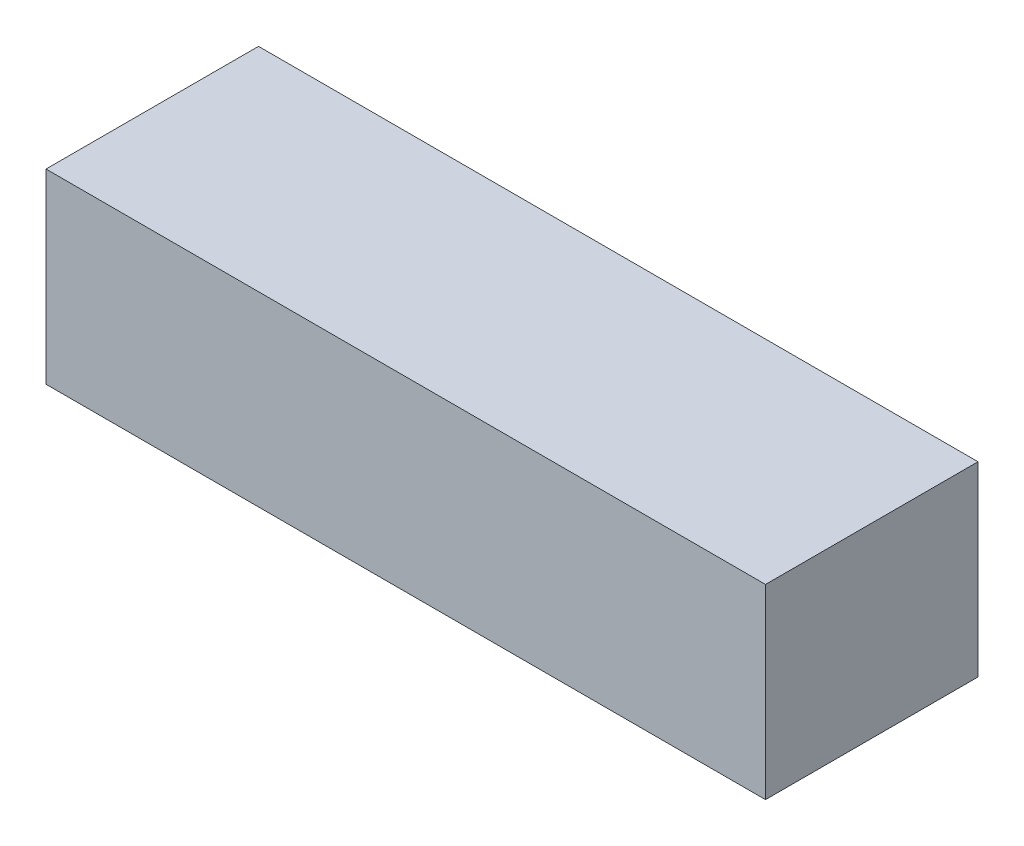
ISO-10303-21;
HEADER;
FILE_DESCRIPTION(('STEP AP214'),'2;1');
FILE_NAME('part.step','',(''),(''),'','','');
FILE_SCHEMA(('AUTOMOTIVE_DESIGN { 1 0 10303 214 1 1 1 1 }'));
ENDSEC;
DATA;
#1=APPLICATION_CONTEXT('core data for automotive mechanical design processes');
#2=APPLICATION_PROTOCOL_DEFINITION('international standard','automotive_design',2000,#1);
#3=PRODUCT_CONTEXT('',#1,'mechanical');
#4=PRODUCT('Part','Part','',(#3));
#5=PRODUCT_RELATED_PRODUCT_CATEGORY('part','',(#4));
#6=PRODUCT_DEFINITION_FORMATION('','',#4);
#7=PRODUCT_DEFINITION_CONTEXT('part definition',#1,'design');
#8=PRODUCT_DEFINITION('design','',#6,#7);
#9=PRODUCT_DEFINITION_SHAPE('','',#8);
#10=(LENGTH_UNIT() NAMED_UNIT(*) SI_UNIT(.MILLI.,.METRE.));
#11=(NAMED_UNIT(*) PLANE_ANGLE_UNIT() SI_UNIT($,.RADIAN.));
#12=(NAMED_UNIT(*) SI_UNIT($,.STERADIAN.) SOLID_ANGLE_UNIT());
#13=UNCERTAINTY_MEASURE_WITH_UNIT(LENGTH_MEASURE(1.E-05),#10,'distance_accuracy_value','');
#14=(GEOMETRIC_REPRESENTATION_CONTEXT(3) GLOBAL_UNCERTAINTY_ASSIGNED_CONTEXT((#13)) GLOBAL_UNIT_ASSIGNED_CONTEXT((#10,
#11,#12)) REPRESENTATION_CONTEXT('',''));
#15=CARTESIAN_POINT('',(0.,0.,0.));
#16=DIRECTION('',(0.,0.,1.));
#17=DIRECTION('',(1.,0.,0.));
#18=AXIS2_PLACEMENT_3D('',#15,#16,#17);
#19=CARTESIAN_POINT('',(49.022,-6.35,7.239));
#20=DIRECTION('',(0.,0.,-1.));
#21=DIRECTION('',(0.,1.,0.));
#22=AXIS2_PLACEMENT_3D('',#19,#20,#21);
#23=PLANE('',#22);
#24=DIRECTION('',(0.,-1.,0.));
#25=VECTOR('',#24,1.);
#26=CARTESIAN_POINT('',(0.,-6.35,7.239));
#27=LINE('',#26,#25);
#28=CARTESIAN_POINT('',(0.,6.35,7.239));
#29=VERTEX_POINT('',#28);
#30=CARTESIAN_POINT('',(0.,-6.35,7.239));
#31=VERTEX_POINT('',#30);
#32=EDGE_CURVE('E97',#29,#31,#27,.T.);
#33=ORIENTED_EDGE('',*,*,#32,.T.);
#34=DIRECTION('',(-1.,0.,0.));
#35=VECTOR('',#34,1.);
#36=CARTESIAN_POINT('',(49.022,-6.35,7.239));
#37=LINE('',#36,#35);
#38=CARTESIAN_POINT('',(49.022,-6.35,7.239));
#39=VERTEX_POINT('',#38);
#40=EDGE_CURVE('E11',#39,#31,#37,.T.);
#41=ORIENTED_EDGE('',*,*,#40,.F.);
#42=DIRECTION('',(0.,-1.,0.));
#43=VECTOR('',#42,1.);
#44=CARTESIAN_POINT('',(49.022,-6.35,7.239));
#45=LINE('',#44,#43);
#46=CARTESIAN_POINT('',(49.022,6.35,7.239));
#47=VERTEX_POINT('',#46);
#48=EDGE_CURVE('E85',#47,#39,#45,.T.);
#49=ORIENTED_EDGE('',*,*,#48,.F.);
#50=DIRECTION('',(-1.,0.,0.));
#51=VECTOR('',#50,1.);
#52=CARTESIAN_POINT('',(49.022,6.35,7.239));
#53=LINE('',#52,#51);
#54=EDGE_CURVE('E93',#47,#29,#53,.T.);
#55=ORIENTED_EDGE('',*,*,#54,.T.);
#56=EDGE_LOOP('',(#33,#41,#49,#55));
#57=FACE_BOUND('',#56,.T.);
#58=ADVANCED_FACE('F34',(#57),#23,.F.);
#59=CARTESIAN_POINT('',(49.022,-6.35,-7.239));
#60=DIRECTION('',(0.,1.,0.));
#61=DIRECTION('',(0.,0.,1.));
#62=AXIS2_PLACEMENT_3D('',#59,#60,#61);
#63=PLANE('',#62);
#64=DIRECTION('',(0.,0.,-1.));
#65=VECTOR('',#64,1.);
#66=CARTESIAN_POINT('',(0.,-6.35,-7.239));
#67=LINE('',#66,#65);
#68=CARTESIAN_POINT('',(0.,-6.35,-7.239));
#69=VERTEX_POINT('',#68);
#70=EDGE_CURVE('E89',#31,#69,#67,.T.);
#71=ORIENTED_EDGE('',*,*,#70,.T.);
#72=DIRECTION('',(-1.,0.,0.));
#73=VECTOR('',#72,1.);
#74=CARTESIAN_POINT('',(49.022,-6.35,-7.239));
#75=LINE('',#74,#73);
#76=CARTESIAN_POINT('',(49.022,-6.35,-7.239));
#77=VERTEX_POINT('',#76);
#78=EDGE_CURVE('E42',#77,#69,#75,.T.);
#79=ORIENTED_EDGE('',*,*,#78,.F.);
#80=DIRECTION('',(0.,0.,-1.));
#81=VECTOR('',#80,1.);
#82=CARTESIAN_POINT('',(49.022,-6.35,-7.239));
#83=LINE('',#82,#81);
#84=EDGE_CURVE('E80',#39,#77,#83,.T.);
#85=ORIENTED_EDGE('',*,*,#84,.F.);
#86=ORIENTED_EDGE('',*,*,#40,.T.);
#87=EDGE_LOOP('',(#71,#79,#85,#86));
#88=FACE_BOUND('',#87,.T.);
#89=ADVANCED_FACE('F88',(#88),#63,.F.);
#90=CARTESIAN_POINT('',(49.022,6.35,-7.239));
#91=DIRECTION('',(0.,0.,1.));
#92=DIRECTION('',(0.,-1.,0.));
#93=AXIS2_PLACEMENT_3D('',#90,#91,#92);
#94=PLANE('',#93);
#95=DIRECTION('',(0.,1.,0.));
#96=VECTOR('',#95,1.);
#97=CARTESIAN_POINT('',(0.,6.35,-7.239));
#98=LINE('',#97,#96);
#99=CARTESIAN_POINT('',(0.,6.35,-7.239));
#100=VERTEX_POINT('',#99);
#101=EDGE_CURVE('E67',#69,#100,#98,.T.);
#102=ORIENTED_EDGE('',*,*,#101,.T.);
#103=DIRECTION('',(-1.,0.,0.));
#104=VECTOR('',#103,1.);
#105=CARTESIAN_POINT('',(49.022,6.35,-7.239));
#106=LINE('',#105,#104);
#107=CARTESIAN_POINT('',(49.022,6.35,-7.239));
#108=VERTEX_POINT('',#107);
#109=EDGE_CURVE('E90',#108,#100,#106,.T.);
#110=ORIENTED_EDGE('',*,*,#109,.F.);
#111=DIRECTION('',(0.,1.,0.));
#112=VECTOR('',#111,1.);
#113=CARTESIAN_POINT('',(49.022,6.35,-7.239));
#114=LINE('',#113,#112);
#115=EDGE_CURVE('E83',#77,#108,#114,.T.);
#116=ORIENTED_EDGE('',*,*,#115,.F.);
#117=ORIENTED_EDGE('',*,*,#78,.T.);
#118=EDGE_LOOP('',(#102,#110,#116,#117));
#119=FACE_BOUND('',#118,.T.);
#120=ADVANCED_FACE('F91',(#119),#94,.F.);
#121=CARTESIAN_POINT('',(49.022,6.35,7.239));
#122=DIRECTION('',(0.,-1.,0.));
#123=DIRECTION('',(0.,0.,-1.));
#124=AXIS2_PLACEMENT_3D('',#121,#122,#123);
#125=PLANE('',#124);
#126=DIRECTION('',(0.,0.,1.));
#127=VECTOR('',#126,1.);
#128=CARTESIAN_POINT('',(0.,6.35,7.239));
#129=LINE('',#128,#127);
#130=EDGE_CURVE('E73',#100,#29,#129,.T.);
#131=ORIENTED_EDGE('',*,*,#130,.T.);
#132=ORIENTED_EDGE('',*,*,#54,.F.);
#133=DIRECTION('',(0.,0.,1.));
#134=VECTOR('',#133,1.);
#135=CARTESIAN_POINT('',(49.022,6.35,7.239));
#136=LINE('',#135,#134);
#137=EDGE_CURVE('E50',#108,#47,#136,.T.);
#138=ORIENTED_EDGE('',*,*,#137,.F.);
#139=ORIENTED_EDGE('',*,*,#109,.T.);
#140=EDGE_LOOP('',(#131,#132,#138,#139));
#141=FACE_BOUND('',#140,.T.);
#142=ADVANCED_FACE('F104',(#141),#125,.F.);
#143=CARTESIAN_POINT('',(49.022,6.35,7.239));
#144=DIRECTION('',(-1.,0.,0.));
#145=DIRECTION('',(0.,0.,1.));
#146=AXIS2_PLACEMENT_3D('',#143,#144,#145);
#147=PLANE('',#146);
#148=ORIENTED_EDGE('',*,*,#48,.T.);
#149=ORIENTED_EDGE('',*,*,#84,.T.);
#150=ORIENTED_EDGE('',*,*,#115,.T.);
#151=ORIENTED_EDGE('',*,*,#137,.T.);
#152=EDGE_LOOP('',(#148,#149,#150,#151));
#153=FACE_BOUND('',#152,.T.);
#154=ADVANCED_FACE('F81',(#153),#147,.F.);
#155=CARTESIAN_POINT('',(0.,6.35,7.239));
#156=DIRECTION('',(-1.,0.,0.));
#157=DIRECTION('',(0.,0.,1.));
#158=AXIS2_PLACEMENT_3D('',#155,#156,#157);
#159=PLANE('',#158);
#160=ORIENTED_EDGE('',*,*,#32,.F.);
#161=ORIENTED_EDGE('',*,*,#130,.F.);
#162=ORIENTED_EDGE('',*,*,#101,.F.);
#163=ORIENTED_EDGE('',*,*,#70,.F.);
#164=EDGE_LOOP('',(#160,#161,#162,#163));
#165=FACE_BOUND('',#164,.T.);
#166=ADVANCED_FACE('F107',(#165),#159,.T.);
#167=CLOSED_SHELL('',(#58,#89,#120,#142,#154,#166));
#168=MANIFOLD_SOLID_BREP('B2',#167);
#169=ADVANCED_BREP_SHAPE_REPRESENTATION('',(#18,#168),#14);
#170=SHAPE_DEFINITION_REPRESENTATION(#9,#169);
ENDSEC;
END-ISO-10303-21;
